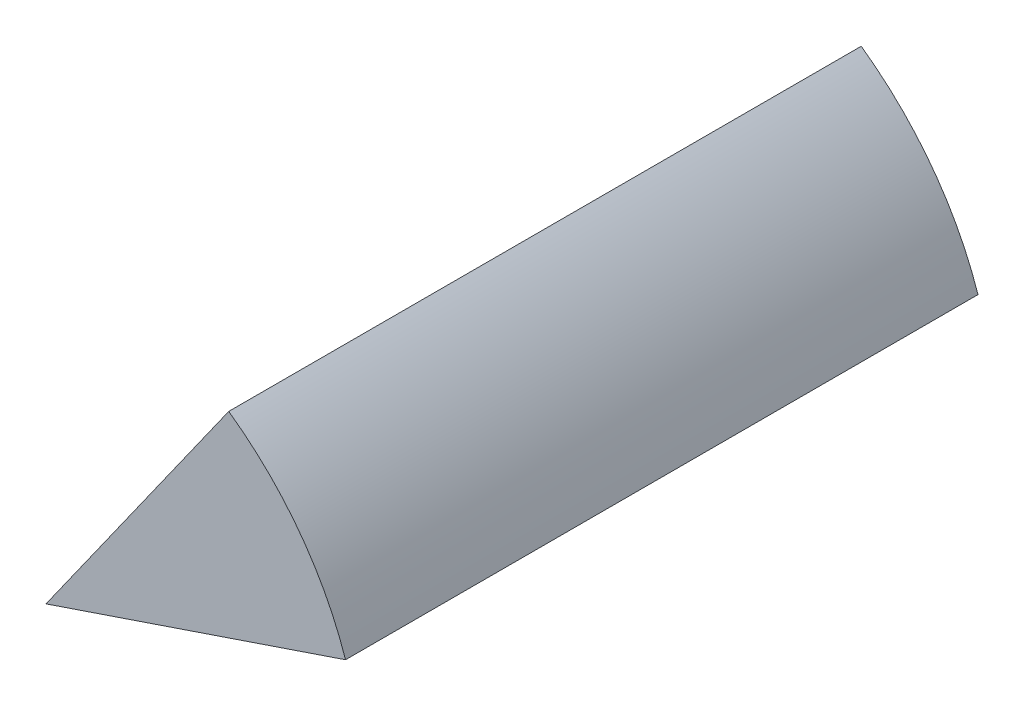
ISO-10303-21;
HEADER;
FILE_DESCRIPTION(('STEP AP214'),'2;1');
FILE_NAME('part.step','',(''),(''),'','','');
FILE_SCHEMA(('AUTOMOTIVE_DESIGN { 1 0 10303 214 1 1 1 1 }'));
ENDSEC;
DATA;
#1=APPLICATION_CONTEXT('core data for automotive mechanical design processes');
#2=APPLICATION_PROTOCOL_DEFINITION('international standard','automotive_design',2000,#1);
#3=PRODUCT_CONTEXT('',#1,'mechanical');
#4=PRODUCT('Part','Part','',(#3));
#5=PRODUCT_RELATED_PRODUCT_CATEGORY('part','',(#4));
#6=PRODUCT_DEFINITION_FORMATION('','',#4);
#7=PRODUCT_DEFINITION_CONTEXT('part definition',#1,'design');
#8=PRODUCT_DEFINITION('design','',#6,#7);
#9=PRODUCT_DEFINITION_SHAPE('','',#8);
#10=(LENGTH_UNIT() NAMED_UNIT(*) SI_UNIT(.MILLI.,.METRE.));
#11=(NAMED_UNIT(*) PLANE_ANGLE_UNIT() SI_UNIT($,.RADIAN.));
#12=(NAMED_UNIT(*) SI_UNIT($,.STERADIAN.) SOLID_ANGLE_UNIT());
#13=UNCERTAINTY_MEASURE_WITH_UNIT(LENGTH_MEASURE(1.E-05),#10,'distance_accuracy_value','');
#14=(GEOMETRIC_REPRESENTATION_CONTEXT(3) GLOBAL_UNCERTAINTY_ASSIGNED_CONTEXT((#13)) GLOBAL_UNIT_ASSIGNED_CONTEXT((#10,
#11,#12)) REPRESENTATION_CONTEXT('',''));
#15=CARTESIAN_POINT('',(0.,0.,0.));
#16=DIRECTION('',(0.,0.,1.));
#17=DIRECTION('',(1.,0.,0.));
#18=AXIS2_PLACEMENT_3D('',#15,#16,#17);
#19=CARTESIAN_POINT('',(0.,0.,50.));
#20=DIRECTION('',(-0.320545459755316,0.947233132987995,0.));
#21=DIRECTION('',(-0.947233132987995,-0.320545459755316,0.));
#22=AXIS2_PLACEMENT_3D('',#19,#20,#21);
#23=PLANE('',#22);
#24=DIRECTION('',(0.947233132987995,0.320545459755316,0.));
#25=VECTOR('',#24,1.);
#26=CARTESIAN_POINT('',(0.,0.,0.));
#27=LINE('',#26,#25);
#28=CARTESIAN_POINT('',(0.,0.,0.));
#29=VERTEX_POINT('',#28);
#30=CARTESIAN_POINT('',(23.6808283246999,8.0136364938829,0.));
#31=VERTEX_POINT('',#30);
#32=EDGE_CURVE('E80',#29,#31,#27,.T.);
#33=ORIENTED_EDGE('',*,*,#32,.T.);
#34=DIRECTION('',(0.,0.,-1.));
#35=VECTOR('',#34,1.);
#36=CARTESIAN_POINT('',(23.6808283246999,8.0136364938829,50.));
#37=LINE('',#36,#35);
#38=CARTESIAN_POINT('',(23.6808283246999,8.0136364938829,50.));
#39=VERTEX_POINT('',#38);
#40=EDGE_CURVE('E11',#39,#31,#37,.T.);
#41=ORIENTED_EDGE('',*,*,#40,.F.);
#42=DIRECTION('',(0.947233132987995,0.320545459755316,0.));
#43=VECTOR('',#42,1.);
#44=CARTESIAN_POINT('',(0.,0.,50.));
#45=LINE('',#44,#43);
#46=CARTESIAN_POINT('',(0.,0.,50.));
#47=VERTEX_POINT('',#46);
#48=EDGE_CURVE('E73',#47,#39,#45,.T.);
#49=ORIENTED_EDGE('',*,*,#48,.F.);
#50=DIRECTION('',(0.,0.,-1.));
#51=VECTOR('',#50,1.);
#52=CARTESIAN_POINT('',(0.,0.,50.));
#53=LINE('',#52,#51);
#54=EDGE_CURVE('E81',#47,#29,#53,.T.);
#55=ORIENTED_EDGE('',*,*,#54,.T.);
#56=EDGE_LOOP('',(#33,#41,#49,#55));
#57=FACE_BOUND('',#56,.T.);
#58=ADVANCED_FACE('F33',(#57),#23,.F.);
#59=CARTESIAN_POINT('',(0.,0.,50.));
#60=DIRECTION('',(0.,0.,-1.));
#61=DIRECTION('',(-1.,0.,0.));
#62=AXIS2_PLACEMENT_3D('',#59,#60,#61);
#63=CYLINDRICAL_SURFACE('',#62,25.);
#64=CARTESIAN_POINT('',(0.,0.,0.));
#65=DIRECTION('',(0.,0.,1.));
#66=DIRECTION('',(1.,0.,0.));
#67=AXIS2_PLACEMENT_3D('',#64,#65,#66);
#68=CIRCLE('',#67,25.);
#69=CARTESIAN_POINT('',(14.4478952072207,20.402409761623,0.));
#70=VERTEX_POINT('',#69);
#71=EDGE_CURVE('E61',#31,#70,#68,.T.);
#72=ORIENTED_EDGE('',*,*,#71,.T.);
#73=DIRECTION('',(0.,0.,-1.));
#74=VECTOR('',#73,1.);
#75=CARTESIAN_POINT('',(14.4478952072207,20.402409761623,50.));
#76=LINE('',#75,#74);
#77=CARTESIAN_POINT('',(14.4478952072207,20.402409761623,50.));
#78=VERTEX_POINT('',#77);
#79=EDGE_CURVE('E41',#78,#70,#76,.T.);
#80=ORIENTED_EDGE('',*,*,#79,.F.);
#81=CARTESIAN_POINT('',(0.,0.,50.));
#82=DIRECTION('',(0.,0.,1.));
#83=DIRECTION('',(1.,0.,0.));
#84=AXIS2_PLACEMENT_3D('',#81,#82,#83);
#85=CIRCLE('',#84,25.);
#86=EDGE_CURVE('E69',#39,#78,#85,.T.);
#87=ORIENTED_EDGE('',*,*,#86,.F.);
#88=ORIENTED_EDGE('',*,*,#40,.T.);
#89=EDGE_LOOP('',(#72,#80,#87,#88));
#90=FACE_BOUND('',#89,.T.);
#91=ADVANCED_FACE('F70',(#90),#63,.T.);
#92=CARTESIAN_POINT('',(0.,0.,50.));
#93=DIRECTION('',(0.816096390464921,-0.577915808288826,0.));
#94=DIRECTION('',(0.577915808288826,0.816096390464921,0.));
#95=AXIS2_PLACEMENT_3D('',#92,#93,#94);
#96=PLANE('',#95);
#97=DIRECTION('',(-0.577915808288826,-0.816096390464921,0.));
#98=VECTOR('',#97,1.);
#99=CARTESIAN_POINT('',(0.,0.,0.));
#100=LINE('',#99,#98);
#101=EDGE_CURVE('E66',#70,#29,#100,.T.);
#102=ORIENTED_EDGE('',*,*,#101,.T.);
#103=ORIENTED_EDGE('',*,*,#54,.F.);
#104=DIRECTION('',(-0.577915808288826,-0.816096390464921,0.));
#105=VECTOR('',#104,1.);
#106=CARTESIAN_POINT('',(0.,0.,50.));
#107=LINE('',#106,#105);
#108=EDGE_CURVE('E49',#78,#47,#107,.T.);
#109=ORIENTED_EDGE('',*,*,#108,.F.);
#110=ORIENTED_EDGE('',*,*,#79,.T.);
#111=EDGE_LOOP('',(#102,#103,#109,#110));
#112=FACE_BOUND('',#111,.T.);
#113=ADVANCED_FACE('F92',(#112),#96,.F.);
#114=CARTESIAN_POINT('',(0.,0.,50.));
#115=DIRECTION('',(0.,0.,1.));
#116=DIRECTION('',(1.,0.,0.));
#117=AXIS2_PLACEMENT_3D('',#114,#115,#116);
#118=PLANE('',#117);
#119=ORIENTED_EDGE('',*,*,#48,.T.);
#120=ORIENTED_EDGE('',*,*,#86,.T.);
#121=ORIENTED_EDGE('',*,*,#108,.T.);
#122=EDGE_LOOP('',(#119,#120,#121));
#123=FACE_BOUND('',#122,.T.);
#124=ADVANCED_FACE('F76',(#123),#118,.T.);
#125=CARTESIAN_POINT('',(0.,0.,0.));
#126=DIRECTION('',(0.,0.,1.));
#127=DIRECTION('',(1.,0.,0.));
#128=AXIS2_PLACEMENT_3D('',#125,#126,#127);
#129=PLANE('',#128);
#130=CARTESIAN_POINT('',(14.9448956442791,11.3343406217158,0.));
#131=DIRECTION('',(0.,0.,-1.));
#132=DIRECTION('',(-1.,0.,0.));
#133=AXIS2_PLACEMENT_3D('',#130,#131,#132);
#134=CIRCLE('',#133,4.98750192041131);
#135=CARTESIAN_POINT('',(9.95739372386784,11.3343406217158,0.));
#136=VERTEX_POINT('',#135);
#137=EDGE_CURVE('E87',#136,#136,#134,.T.);
#138=ORIENTED_EDGE('',*,*,#137,.F.);
#139=EDGE_LOOP('',(#138));
#140=FACE_BOUND('',#139,.T.);
#141=ORIENTED_EDGE('',*,*,#32,.F.);
#142=ORIENTED_EDGE('',*,*,#101,.F.);
#143=ORIENTED_EDGE('',*,*,#71,.F.);
#144=EDGE_LOOP('',(#141,#142,#143));
#145=FACE_BOUND('',#144,.T.);
#146=ADVANCED_FACE('F93',(#140,#145),#129,.F.);
#147=CARTESIAN_POINT('',(14.9448956442791,11.3343406217158,10.));
#148=DIRECTION('',(0.,0.,-1.));
#149=DIRECTION('',(-1.,0.,0.));
#150=AXIS2_PLACEMENT_3D('',#147,#148,#149);
#151=CYLINDRICAL_SURFACE('',#150,4.98750192041131);
#152=CARTESIAN_POINT('',(14.9448956442791,11.3343406217158,10.));
#153=DIRECTION('',(0.,0.,-1.));
#154=DIRECTION('',(-1.,0.,0.));
#155=AXIS2_PLACEMENT_3D('',#152,#153,#154);
#156=CIRCLE('',#155,4.98750192041131);
#157=CARTESIAN_POINT('',(9.95739372386784,11.3343406217158,10.));
#158=VERTEX_POINT('',#157);
#159=EDGE_CURVE('E83',#158,#158,#156,.T.);
#160=ORIENTED_EDGE('',*,*,#159,.F.);
#161=EDGE_LOOP('',(#160));
#162=FACE_BOUND('',#161,.T.);
#163=ORIENTED_EDGE('',*,*,#137,.T.);
#164=EDGE_LOOP('',(#163));
#165=FACE_BOUND('',#164,.T.);
#166=ADVANCED_FACE('F95',(#162,#165),#151,.F.);
#167=CARTESIAN_POINT('',(14.9448956442791,11.3343406217158,10.));
#168=DIRECTION('',(0.,0.,-1.));
#169=DIRECTION('',(-1.,0.,0.));
#170=AXIS2_PLACEMENT_3D('',#167,#168,#169);
#171=PLANE('',#170);
#172=ORIENTED_EDGE('',*,*,#159,.T.);
#173=EDGE_LOOP('',(#172));
#174=FACE_BOUND('',#173,.T.);
#175=ADVANCED_FACE('F102',(#174),#171,.T.);
#176=CLOSED_SHELL('',(#58,#91,#113,#124,#146,#166,#175));
#177=MANIFOLD_SOLID_BREP('B2',#176);
#178=ADVANCED_BREP_SHAPE_REPRESENTATION('',(#18,#177),#14);
#179=SHAPE_DEFINITION_REPRESENTATION(#9,#178);
ENDSEC;
END-ISO-10303-21;
